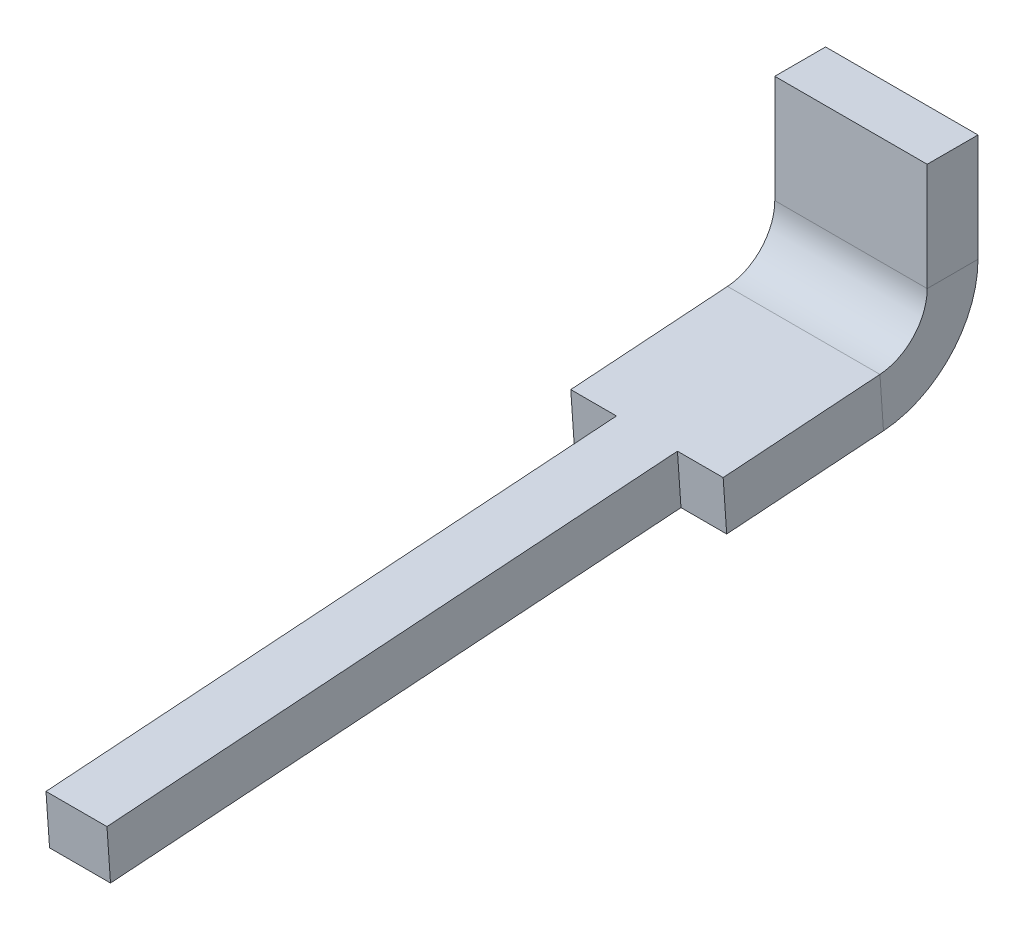
ISO-10303-21;
HEADER;
FILE_DESCRIPTION(('STEP AP214'),'2;1');
FILE_NAME('part.step','',(''),(''),'','','');
FILE_SCHEMA(('AUTOMOTIVE_DESIGN { 1 0 10303 214 1 1 1 1 }'));
ENDSEC;
DATA;
#1=APPLICATION_CONTEXT('core data for automotive mechanical design processes');
#2=APPLICATION_PROTOCOL_DEFINITION('international standard','automotive_design',2000,#1);
#3=PRODUCT_CONTEXT('',#1,'mechanical');
#4=PRODUCT('Part','Part','',(#3));
#5=PRODUCT_RELATED_PRODUCT_CATEGORY('part','',(#4));
#6=PRODUCT_DEFINITION_FORMATION('','',#4);
#7=PRODUCT_DEFINITION_CONTEXT('part definition',#1,'design');
#8=PRODUCT_DEFINITION('design','',#6,#7);
#9=PRODUCT_DEFINITION_SHAPE('','',#8);
#10=(LENGTH_UNIT() NAMED_UNIT(*) SI_UNIT(.MILLI.,.METRE.));
#11=(NAMED_UNIT(*) PLANE_ANGLE_UNIT() SI_UNIT($,.RADIAN.));
#12=(NAMED_UNIT(*) SI_UNIT($,.STERADIAN.) SOLID_ANGLE_UNIT());
#13=UNCERTAINTY_MEASURE_WITH_UNIT(LENGTH_MEASURE(1.E-05),#10,'distance_accuracy_value','');
#14=(GEOMETRIC_REPRESENTATION_CONTEXT(3) GLOBAL_UNCERTAINTY_ASSIGNED_CONTEXT((#13)) GLOBAL_UNIT_ASSIGNED_CONTEXT((#10,
#11,#12)) REPRESENTATION_CONTEXT('',''));
#15=CARTESIAN_POINT('',(0.,0.,0.));
#16=DIRECTION('',(0.,0.,1.));
#17=DIRECTION('',(1.,0.,0.));
#18=AXIS2_PLACEMENT_3D('',#15,#16,#17);
#19=CARTESIAN_POINT('',(3.88578058618805E-13,-2.2413203435652,-0.01));
#20=DIRECTION('',(0.,-1.,0.));
#21=DIRECTION('',(1.,0.,0.));
#22=AXIS2_PLACEMENT_3D('',#19,#20,#21);
#23=PLANE('',#22);
#24=DIRECTION('',(1.,0.,0.));
#25=VECTOR('',#24,1.);
#26=CARTESIAN_POINT('',(0.,-2.2413203435652,0.5));
#27=LINE('',#26,#25);
#28=CARTESIAN_POINT('',(13.077499999997,-2.2413203435652,0.5));
#29=VERTEX_POINT('',#28);
#30=CARTESIAN_POINT('',(14.5775000000007,-2.2413203435652,0.5));
#31=VERTEX_POINT('',#30);
#32=EDGE_CURVE('E11',#29,#31,#27,.T.);
#33=ORIENTED_EDGE('',*,*,#32,.T.);
#34=DIRECTION('',(0.,0.,1.));
#35=VECTOR('',#34,1.);
#36=CARTESIAN_POINT('',(14.5775000000007,-2.2413203435652,0.5));
#37=LINE('',#36,#35);
#38=CARTESIAN_POINT('',(14.5775000000007,-2.2413203435652,0.));
#39=VERTEX_POINT('',#38);
#40=EDGE_CURVE('E24',#39,#31,#37,.T.);
#41=ORIENTED_EDGE('',*,*,#40,.F.);
#42=DIRECTION('',(1.,0.,0.));
#43=VECTOR('',#42,1.);
#44=CARTESIAN_POINT('',(0.,-2.2413203435652,0.));
#45=LINE('',#44,#43);
#46=CARTESIAN_POINT('',(13.077499999997,-2.2413203435652,0.));
#47=VERTEX_POINT('',#46);
#48=EDGE_CURVE('E211',#47,#39,#45,.T.);
#49=ORIENTED_EDGE('',*,*,#48,.F.);
#50=DIRECTION('',(0.,0.,-1.));
#51=VECTOR('',#50,1.);
#52=CARTESIAN_POINT('',(13.077499999997,-2.2413203435652,0.5));
#53=LINE('',#52,#51);
#54=EDGE_CURVE('E208',#29,#47,#53,.T.);
#55=ORIENTED_EDGE('',*,*,#54,.F.);
#56=EDGE_LOOP('',(#33,#41,#49,#55));
#57=FACE_BOUND('',#56,.T.);
#58=ADVANCED_FACE('F17',(#57),#23,.F.);
#59=CARTESIAN_POINT('',(13.077499999997,0.,0.5));
#60=DIRECTION('',(1.,0.,0.));
#61=DIRECTION('',(0.,0.,-1.));
#62=AXIS2_PLACEMENT_3D('',#59,#60,#61);
#63=PLANE('',#62);
#64=DIRECTION('',(0.,-1.,0.));
#65=VECTOR('',#64,1.);
#66=CARTESIAN_POINT('',(13.077499999997,0.,0.5));
#67=LINE('',#66,#65);
#68=CARTESIAN_POINT('',(13.077499999997,-3.3009203435652,0.5));
#69=VERTEX_POINT('',#68);
#70=EDGE_CURVE('E206',#29,#69,#67,.T.);
#71=ORIENTED_EDGE('',*,*,#70,.F.);
#72=ORIENTED_EDGE('',*,*,#54,.T.);
#73=DIRECTION('',(0.,-1.,0.));
#74=VECTOR('',#73,1.);
#75=CARTESIAN_POINT('',(13.077499999997,0.,0.));
#76=LINE('',#75,#74);
#77=CARTESIAN_POINT('',(13.077499999997,-3.3009203435652,0.));
#78=VERTEX_POINT('',#77);
#79=EDGE_CURVE('E204',#47,#78,#76,.T.);
#80=ORIENTED_EDGE('',*,*,#79,.T.);
#81=DIRECTION('',(0.,0.,1.));
#82=VECTOR('',#81,1.);
#83=CARTESIAN_POINT('',(13.077499999997,-3.3009203435652,0.499999999999977));
#84=LINE('',#83,#82);
#85=EDGE_CURVE('E201',#78,#69,#84,.T.);
#86=ORIENTED_EDGE('',*,*,#85,.T.);
#87=EDGE_LOOP('',(#71,#72,#80,#86));
#88=FACE_BOUND('',#87,.T.);
#89=ADVANCED_FACE('F265',(#88),#63,.F.);
#90=CARTESIAN_POINT('',(0.,0.,0.5));
#91=DIRECTION('',(0.,0.,1.));
#92=DIRECTION('',(1.,0.,0.));
#93=AXIS2_PLACEMENT_3D('',#90,#91,#92);
#94=PLANE('',#93);
#95=ORIENTED_EDGE('',*,*,#32,.F.);
#96=ORIENTED_EDGE('',*,*,#70,.T.);
#97=DIRECTION('',(-1.,0.,0.));
#98=VECTOR('',#97,1.);
#99=CARTESIAN_POINT('',(0.,-3.3009203435652,0.5));
#100=LINE('',#99,#98);
#101=CARTESIAN_POINT('',(14.5775000000007,-3.3009203435652,0.5));
#102=VERTEX_POINT('',#101);
#103=EDGE_CURVE('E198',#102,#69,#100,.T.);
#104=ORIENTED_EDGE('',*,*,#103,.F.);
#105=DIRECTION('',(0.,1.,0.));
#106=VECTOR('',#105,1.);
#107=CARTESIAN_POINT('',(14.5775000000007,0.,0.5));
#108=LINE('',#107,#106);
#109=EDGE_CURVE('E196',#102,#31,#108,.T.);
#110=ORIENTED_EDGE('',*,*,#109,.T.);
#111=EDGE_LOOP('',(#95,#96,#104,#110));
#112=FACE_BOUND('',#111,.T.);
#113=ADVANCED_FACE('F217',(#112),#94,.T.);
#114=CARTESIAN_POINT('',(0.,0.,0.));
#115=DIRECTION('',(0.,0.,1.));
#116=DIRECTION('',(1.,0.,0.));
#117=AXIS2_PLACEMENT_3D('',#114,#115,#116);
#118=PLANE('',#117);
#119=ORIENTED_EDGE('',*,*,#79,.F.);
#120=ORIENTED_EDGE('',*,*,#48,.T.);
#121=DIRECTION('',(0.,1.,0.));
#122=VECTOR('',#121,1.);
#123=CARTESIAN_POINT('',(14.5775000000007,0.,0.));
#124=LINE('',#123,#122);
#125=CARTESIAN_POINT('',(14.5775000000007,-3.3009203435652,0.));
#126=VERTEX_POINT('',#125);
#127=EDGE_CURVE('E193',#126,#39,#124,.T.);
#128=ORIENTED_EDGE('',*,*,#127,.F.);
#129=DIRECTION('',(-1.,0.,0.));
#130=VECTOR('',#129,1.);
#131=CARTESIAN_POINT('',(0.,-3.3009203435652,0.));
#132=LINE('',#131,#130);
#133=EDGE_CURVE('E190',#126,#78,#132,.T.);
#134=ORIENTED_EDGE('',*,*,#133,.T.);
#135=EDGE_LOOP('',(#119,#120,#128,#134));
#136=FACE_BOUND('',#135,.T.);
#137=ADVANCED_FACE('F273',(#136),#118,.F.);
#138=CARTESIAN_POINT('',(13.077499999997,-3.3009203435652,1.));
#139=DIRECTION('',(1.,0.,0.));
#140=DIRECTION('',(0.,0.,-1.));
#141=AXIS2_PLACEMENT_3D('',#138,#139,#140);
#142=PLANE('',#141);
#143=CARTESIAN_POINT('',(13.077499999997,-3.3009203435652,1.));
#144=DIRECTION('',(-1.,0.,0.));
#145=DIRECTION('',(0.,0.,-1.));
#146=AXIS2_PLACEMENT_3D('',#143,#144,#145);
#147=CIRCLE('',#146,1.);
#148=CARTESIAN_POINT('',(13.077499999997,-4.298484393825,0.930243526255876));
#149=VERTEX_POINT('',#148);
#150=EDGE_CURVE('E188',#78,#149,#147,.T.);
#151=ORIENTED_EDGE('',*,*,#150,.T.);
#152=DIRECTION('',(0.,0.997564050259824,0.0697564737441289));
#153=VECTOR('',#152,1.);
#154=CARTESIAN_POINT('',(13.077499999997,-3.7997023686951,0.965121763127938));
#155=LINE('',#154,#153);
#156=CARTESIAN_POINT('',(13.077499999997,-3.7997023686951,0.965121763127939));
#157=VERTEX_POINT('',#156);
#158=EDGE_CURVE('E186',#149,#157,#155,.T.);
#159=ORIENTED_EDGE('',*,*,#158,.T.);
#160=CARTESIAN_POINT('',(13.077499999997,-3.3009203435652,1.));
#161=DIRECTION('',(-1.,0.,0.));
#162=DIRECTION('',(0.,0.,1.));
#163=AXIS2_PLACEMENT_3D('',#160,#161,#162);
#164=CIRCLE('',#163,0.5);
#165=EDGE_CURVE('E183',#69,#157,#164,.T.);
#166=ORIENTED_EDGE('',*,*,#165,.F.);
#167=ORIENTED_EDGE('',*,*,#85,.F.);
#168=EDGE_LOOP('',(#151,#159,#166,#167));
#169=FACE_BOUND('',#168,.T.);
#170=ADVANCED_FACE('F226',(#169),#142,.F.);
#171=CARTESIAN_POINT('',(14.5775000000007,0.,0.5));
#172=DIRECTION('',(-1.,0.,0.));
#173=DIRECTION('',(0.,-1.,0.));
#174=AXIS2_PLACEMENT_3D('',#171,#172,#173);
#175=PLANE('',#174);
#176=ORIENTED_EDGE('',*,*,#127,.T.);
#177=ORIENTED_EDGE('',*,*,#40,.T.);
#178=ORIENTED_EDGE('',*,*,#109,.F.);
#179=DIRECTION('',(0.,0.,-1.));
#180=VECTOR('',#179,1.);
#181=CARTESIAN_POINT('',(14.5775000000007,-3.3009203435652,0.499999999999977));
#182=LINE('',#181,#180);
#183=EDGE_CURVE('E180',#102,#126,#182,.T.);
#184=ORIENTED_EDGE('',*,*,#183,.T.);
#185=EDGE_LOOP('',(#176,#177,#178,#184));
#186=FACE_BOUND('',#185,.T.);
#187=ADVANCED_FACE('F215',(#186),#175,.F.);
#188=CARTESIAN_POINT('',(11.8865505878094,-3.3009203435652,1.));
#189=DIRECTION('',(1.,0.,0.));
#190=DIRECTION('',(0.,0.,-1.));
#191=AXIS2_PLACEMENT_3D('',#188,#189,#190);
#192=CYLINDRICAL_SURFACE('',#191,1.);
#193=ORIENTED_EDGE('',*,*,#133,.F.);
#194=CARTESIAN_POINT('',(14.5775000000007,-3.3009203435652,1.));
#195=DIRECTION('',(1.,0.,0.));
#196=DIRECTION('',(0.,0.,-1.));
#197=AXIS2_PLACEMENT_3D('',#194,#195,#196);
#198=CIRCLE('',#197,1.);
#199=CARTESIAN_POINT('',(14.5775000000007,-4.298484393825,0.930243526255876));
#200=VERTEX_POINT('',#199);
#201=EDGE_CURVE('E177',#200,#126,#198,.T.);
#202=ORIENTED_EDGE('',*,*,#201,.F.);
#203=DIRECTION('',(-1.,0.,0.));
#204=VECTOR('',#203,1.);
#205=CARTESIAN_POINT('',(0.,-4.298484393825,0.930243526255876));
#206=LINE('',#205,#204);
#207=EDGE_CURVE('E174',#200,#149,#206,.T.);
#208=ORIENTED_EDGE('',*,*,#207,.T.);
#209=ORIENTED_EDGE('',*,*,#150,.F.);
#210=EDGE_LOOP('',(#193,#202,#208,#209));
#211=FACE_BOUND('',#210,.T.);
#212=ADVANCED_FACE('F236',(#211),#192,.T.);
#213=CARTESIAN_POINT('',(14.5775000000007,-3.3009203435652,1.));
#214=DIRECTION('',(-1.,0.,0.));
#215=DIRECTION('',(0.,0.,1.));
#216=AXIS2_PLACEMENT_3D('',#213,#214,#215);
#217=PLANE('',#216);
#218=DIRECTION('',(0.,-0.997564050259824,-0.0697564737441289));
#219=VECTOR('',#218,1.);
#220=CARTESIAN_POINT('',(14.5775000000007,-3.7997023686951,0.965121763127938));
#221=LINE('',#220,#219);
#222=CARTESIAN_POINT('',(14.5775000000007,-3.7997023686951,0.965121763127938));
#223=VERTEX_POINT('',#222);
#224=EDGE_CURVE('E171',#223,#200,#221,.T.);
#225=ORIENTED_EDGE('',*,*,#224,.T.);
#226=ORIENTED_EDGE('',*,*,#201,.T.);
#227=ORIENTED_EDGE('',*,*,#183,.F.);
#228=CARTESIAN_POINT('',(14.5775000000007,-3.3009203435652,1.));
#229=DIRECTION('',(1.,0.,0.));
#230=DIRECTION('',(0.,0.,-1.));
#231=AXIS2_PLACEMENT_3D('',#228,#229,#230);
#232=CIRCLE('',#231,0.5);
#233=EDGE_CURVE('E168',#223,#102,#232,.T.);
#234=ORIENTED_EDGE('',*,*,#233,.F.);
#235=EDGE_LOOP('',(#225,#226,#227,#234));
#236=FACE_BOUND('',#235,.T.);
#237=ADVANCED_FACE('F254',(#236),#217,.F.);
#238=CARTESIAN_POINT('',(11.8865505878094,-3.3009203435652,1.));
#239=DIRECTION('',(1.,0.,0.));
#240=DIRECTION('',(0.,0.,-1.));
#241=AXIS2_PLACEMENT_3D('',#238,#239,#240);
#242=CYLINDRICAL_SURFACE('',#241,0.5);
#243=ORIENTED_EDGE('',*,*,#103,.T.);
#244=ORIENTED_EDGE('',*,*,#165,.T.);
#245=DIRECTION('',(-1.,0.,0.));
#246=VECTOR('',#245,1.);
#247=CARTESIAN_POINT('',(0.,-3.7997023686951,0.965121763127941));
#248=LINE('',#247,#246);
#249=EDGE_CURVE('E165',#223,#157,#248,.T.);
#250=ORIENTED_EDGE('',*,*,#249,.F.);
#251=ORIENTED_EDGE('',*,*,#233,.T.);
#252=EDGE_LOOP('',(#243,#244,#250,#251));
#253=FACE_BOUND('',#252,.T.);
#254=ADVANCED_FACE('F221',(#253),#242,.F.);
#255=CARTESIAN_POINT('',(13.077499999997,-3.4909143362964,-3.4507528322724));
#256=DIRECTION('',(1.,0.,0.));
#257=DIRECTION('',(0.,-0.997564050259825,-0.0697564737441219));
#258=AXIS2_PLACEMENT_3D('',#255,#256,#257);
#259=PLANE('',#258);
#260=ORIENTED_EDGE('',*,*,#158,.F.);
#261=DIRECTION('',(0.,-0.0697564737441219,0.997564050259824));
#262=VECTOR('',#261,1.);
#263=CARTESIAN_POINT('',(13.077499999997,-3.9896963614263,-3.4856310691444));
#264=LINE('',#263,#262);
#265=CARTESIAN_POINT('',(13.077499999997,-4.4063741251374,2.4731385662806));
#266=VERTEX_POINT('',#265);
#267=EDGE_CURVE('E163',#149,#266,#264,.T.);
#268=ORIENTED_EDGE('',*,*,#267,.T.);
#269=DIRECTION('',(0.,-0.997564050259824,-0.0697564737441219));
#270=VECTOR('',#269,1.);
#271=CARTESIAN_POINT('',(13.077499999997,-3.9075921000075,2.5080168031527));
#272=LINE('',#271,#270);
#273=CARTESIAN_POINT('',(13.077499999997,-3.9075921000075,2.5080168031527));
#274=VERTEX_POINT('',#273);
#275=EDGE_CURVE('E160',#274,#266,#272,.T.);
#276=ORIENTED_EDGE('',*,*,#275,.F.);
#277=DIRECTION('',(0.,-0.0697564737441219,0.997564050259824));
#278=VECTOR('',#277,1.);
#279=CARTESIAN_POINT('',(13.077499999997,-3.4909143362964,-3.4507528322724));
#280=LINE('',#279,#278);
#281=EDGE_CURVE('E157',#157,#274,#280,.T.);
#282=ORIENTED_EDGE('',*,*,#281,.F.);
#283=EDGE_LOOP('',(#260,#268,#276,#282));
#284=FACE_BOUND('',#283,.T.);
#285=ADVANCED_FACE('F231',(#284),#259,.F.);
#286=CARTESIAN_POINT('',(0.,-3.9896963614263,-3.4856310691444));
#287=DIRECTION('',(0.,0.997564050259825,0.0697564737441219));
#288=DIRECTION('',(1.,0.,0.));
#289=AXIS2_PLACEMENT_3D('',#286,#287,#288);
#290=PLANE('',#289);
#291=ORIENTED_EDGE('',*,*,#207,.F.);
#292=DIRECTION('',(0.,0.0697564737441219,-0.997564050259824));
#293=VECTOR('',#292,1.);
#294=CARTESIAN_POINT('',(14.5775000000007,-3.9896963614263,-3.4856310691445));
#295=LINE('',#294,#293);
#296=CARTESIAN_POINT('',(14.5775000000007,-4.4063741251374,2.4731385662806));
#297=VERTEX_POINT('',#296);
#298=EDGE_CURVE('E154',#297,#200,#295,.T.);
#299=ORIENTED_EDGE('',*,*,#298,.F.);
#300=DIRECTION('',(1.,0.,0.));
#301=VECTOR('',#300,1.);
#302=CARTESIAN_POINT('',(0.,-4.4063741251374,2.4731385662806));
#303=LINE('',#302,#301);
#304=CARTESIAN_POINT('',(14.1274999999978,-4.4063741251374,2.4731385662806));
#305=VERTEX_POINT('',#304);
#306=EDGE_CURVE('E152',#305,#297,#303,.T.);
#307=ORIENTED_EDGE('',*,*,#306,.F.);
#308=DIRECTION('',(0.,0.0697564737441219,-0.997564050259824));
#309=VECTOR('',#308,1.);
#310=CARTESIAN_POINT('',(14.1274999999978,-3.9896963614263,-3.4856310691444));
#311=LINE('',#310,#309);
#312=CARTESIAN_POINT('',(14.1274999999978,-4.7989635593689,8.0874290411376));
#313=VERTEX_POINT('',#312);
#314=EDGE_CURVE('E125',#313,#305,#311,.T.);
#315=ORIENTED_EDGE('',*,*,#314,.F.);
#316=DIRECTION('',(1.,0.,0.));
#317=VECTOR('',#316,1.);
#318=CARTESIAN_POINT('',(0.,-4.7989635593689,8.0874290411376));
#319=LINE('',#318,#317);
#320=CARTESIAN_POINT('',(13.5274999999998,-4.7989635593689,8.0874290411376));
#321=VERTEX_POINT('',#320);
#322=EDGE_CURVE('E148',#321,#313,#319,.T.);
#323=ORIENTED_EDGE('',*,*,#322,.F.);
#324=DIRECTION('',(0.,-0.0697564737441219,0.997564050259824));
#325=VECTOR('',#324,1.);
#326=CARTESIAN_POINT('',(13.5274999999998,-3.9896963614263,-3.4856310691444));
#327=LINE('',#326,#325);
#328=CARTESIAN_POINT('',(13.5274999999998,-4.4063741251374,2.4731385662806));
#329=VERTEX_POINT('',#328);
#330=EDGE_CURVE('E145',#329,#321,#327,.T.);
#331=ORIENTED_EDGE('',*,*,#330,.F.);
#332=DIRECTION('',(1.,0.,0.));
#333=VECTOR('',#332,1.);
#334=CARTESIAN_POINT('',(0.,-4.4063741251374,2.4731385662806));
#335=LINE('',#334,#333);
#336=EDGE_CURVE('E142',#266,#329,#335,.T.);
#337=ORIENTED_EDGE('',*,*,#336,.F.);
#338=ORIENTED_EDGE('',*,*,#267,.F.);
#339=EDGE_LOOP('',(#291,#299,#307,#315,#323,#331,#337,#338));
#340=FACE_BOUND('',#339,.T.);
#341=ADVANCED_FACE('F239',(#340),#290,.F.);
#342=CARTESIAN_POINT('',(14.5775000000007,-3.4909143362964,-3.4507528322724));
#343=DIRECTION('',(-1.,0.,0.));
#344=DIRECTION('',(0.,-0.0697564737441219,0.997564050259825));
#345=AXIS2_PLACEMENT_3D('',#342,#343,#344);
#346=PLANE('',#345);
#347=ORIENTED_EDGE('',*,*,#224,.F.);
#348=DIRECTION('',(0.,0.0697564737441219,-0.997564050259824));
#349=VECTOR('',#348,1.);
#350=CARTESIAN_POINT('',(14.5775000000007,-3.4909143362964,-3.4507528322724));
#351=LINE('',#350,#349);
#352=CARTESIAN_POINT('',(14.5775000000007,-3.9075921000075,2.5080168031527));
#353=VERTEX_POINT('',#352);
#354=EDGE_CURVE('E140',#353,#223,#351,.T.);
#355=ORIENTED_EDGE('',*,*,#354,.F.);
#356=DIRECTION('',(0.,-0.997564050259824,-0.0697564737441219));
#357=VECTOR('',#356,1.);
#358=CARTESIAN_POINT('',(14.5775000000007,-3.9075921000075,2.5080168031527));
#359=LINE('',#358,#357);
#360=EDGE_CURVE('E120',#353,#297,#359,.T.);
#361=ORIENTED_EDGE('',*,*,#360,.T.);
#362=ORIENTED_EDGE('',*,*,#298,.T.);
#363=EDGE_LOOP('',(#347,#355,#361,#362));
#364=FACE_BOUND('',#363,.T.);
#365=ADVANCED_FACE('F252',(#364),#346,.F.);
#366=CARTESIAN_POINT('',(0.,-3.4909143362964,-3.4507528322724));
#367=DIRECTION('',(0.,0.997564050259825,0.0697564737441219));
#368=DIRECTION('',(1.,0.,0.));
#369=AXIS2_PLACEMENT_3D('',#366,#367,#368);
#370=PLANE('',#369);
#371=ORIENTED_EDGE('',*,*,#354,.T.);
#372=ORIENTED_EDGE('',*,*,#249,.T.);
#373=ORIENTED_EDGE('',*,*,#281,.T.);
#374=DIRECTION('',(1.,0.,0.));
#375=VECTOR('',#374,1.);
#376=CARTESIAN_POINT('',(0.,-3.9075921000075,2.5080168031527));
#377=LINE('',#376,#375);
#378=CARTESIAN_POINT('',(13.5274999999998,-3.9075921000075,2.5080168031527));
#379=VERTEX_POINT('',#378);
#380=EDGE_CURVE('E137',#274,#379,#377,.T.);
#381=ORIENTED_EDGE('',*,*,#380,.T.);
#382=DIRECTION('',(0.,-0.0697564737441219,0.997564050259824));
#383=VECTOR('',#382,1.);
#384=CARTESIAN_POINT('',(13.5274999999998,-3.4909143362964,-3.4507528322724));
#385=LINE('',#384,#383);
#386=CARTESIAN_POINT('',(13.5274999999998,-4.300181534239,8.1223072780096));
#387=VERTEX_POINT('',#386);
#388=EDGE_CURVE('E135',#379,#387,#385,.T.);
#389=ORIENTED_EDGE('',*,*,#388,.T.);
#390=DIRECTION('',(1.,0.,0.));
#391=VECTOR('',#390,1.);
#392=CARTESIAN_POINT('',(0.,-4.300181534239,8.1223072780096));
#393=LINE('',#392,#391);
#394=CARTESIAN_POINT('',(14.1274999999978,-4.300181534239,8.1223072780096));
#395=VERTEX_POINT('',#394);
#396=EDGE_CURVE('E107',#387,#395,#393,.T.);
#397=ORIENTED_EDGE('',*,*,#396,.T.);
#398=DIRECTION('',(0.,0.0697564737441219,-0.997564050259824));
#399=VECTOR('',#398,1.);
#400=CARTESIAN_POINT('',(14.1274999999978,-3.4909143362964,-3.4507528322724));
#401=LINE('',#400,#399);
#402=CARTESIAN_POINT('',(14.1274999999978,-3.9075921000075,2.5080168031527));
#403=VERTEX_POINT('',#402);
#404=EDGE_CURVE('E101',#395,#403,#401,.T.);
#405=ORIENTED_EDGE('',*,*,#404,.T.);
#406=DIRECTION('',(1.,0.,0.));
#407=VECTOR('',#406,1.);
#408=CARTESIAN_POINT('',(0.,-3.9075921000075,2.5080168031527));
#409=LINE('',#408,#407);
#410=EDGE_CURVE('E105',#403,#353,#409,.T.);
#411=ORIENTED_EDGE('',*,*,#410,.T.);
#412=EDGE_LOOP('',(#371,#372,#373,#381,#389,#397,#405,#411));
#413=FACE_BOUND('',#412,.T.);
#414=ADVANCED_FACE('F104',(#413),#370,.T.);
#415=CARTESIAN_POINT('',(0.,-3.9075921000075,2.5080168031527));
#416=DIRECTION('',(0.,0.0697564737441219,-0.997564050259825));
#417=DIRECTION('',(0.,0.997564050259825,0.0697564737441219));
#418=AXIS2_PLACEMENT_3D('',#415,#416,#417);
#419=PLANE('',#418);
#420=ORIENTED_EDGE('',*,*,#336,.T.);
#421=DIRECTION('',(0.,-0.997564050259824,-0.0697564737441219));
#422=VECTOR('',#421,1.);
#423=CARTESIAN_POINT('',(13.5274999999998,-3.9075921000075,2.5080168031527));
#424=LINE('',#423,#422);
#425=EDGE_CURVE('E121',#379,#329,#424,.T.);
#426=ORIENTED_EDGE('',*,*,#425,.F.);
#427=ORIENTED_EDGE('',*,*,#380,.F.);
#428=ORIENTED_EDGE('',*,*,#275,.T.);
#429=EDGE_LOOP('',(#420,#426,#427,#428));
#430=FACE_BOUND('',#429,.T.);
#431=ADVANCED_FACE('F242',(#430),#419,.F.);
#432=CARTESIAN_POINT('',(0.,-3.9075921000075,2.5080168031527));
#433=DIRECTION('',(0.,0.0697564737441219,-0.997564050259825));
#434=DIRECTION('',(0.,0.997564050259825,0.0697564737441219));
#435=AXIS2_PLACEMENT_3D('',#432,#433,#434);
#436=PLANE('',#435);
#437=ORIENTED_EDGE('',*,*,#306,.T.);
#438=ORIENTED_EDGE('',*,*,#360,.F.);
#439=ORIENTED_EDGE('',*,*,#410,.F.);
#440=DIRECTION('',(0.,-0.997564050259824,-0.0697564737441219));
#441=VECTOR('',#440,1.);
#442=CARTESIAN_POINT('',(14.1274999999978,-3.9075921000075,2.5080168031527));
#443=LINE('',#442,#441);
#444=EDGE_CURVE('E118',#403,#305,#443,.T.);
#445=ORIENTED_EDGE('',*,*,#444,.T.);
#446=EDGE_LOOP('',(#437,#438,#439,#445));
#447=FACE_BOUND('',#446,.T.);
#448=ADVANCED_FACE('F117',(#447),#436,.F.);
#449=CARTESIAN_POINT('',(14.1274999999978,-3.4909143362964,-3.4507528322724));
#450=DIRECTION('',(-1.,0.,0.));
#451=DIRECTION('',(0.,0.997564050259825,0.0697564737441219));
#452=AXIS2_PLACEMENT_3D('',#449,#450,#451);
#453=PLANE('',#452);
#454=ORIENTED_EDGE('',*,*,#314,.T.);
#455=ORIENTED_EDGE('',*,*,#444,.F.);
#456=ORIENTED_EDGE('',*,*,#404,.F.);
#457=DIRECTION('',(0.,-0.997564050259824,-0.0697564737441219));
#458=VECTOR('',#457,1.);
#459=CARTESIAN_POINT('',(14.1274999999978,-4.300181534239,8.1223072780096));
#460=LINE('',#459,#458);
#461=EDGE_CURVE('E126',#395,#313,#460,.T.);
#462=ORIENTED_EDGE('',*,*,#461,.T.);
#463=EDGE_LOOP('',(#454,#455,#456,#462));
#464=FACE_BOUND('',#463,.T.);
#465=ADVANCED_FACE('F124',(#464),#453,.F.);
#466=CARTESIAN_POINT('',(0.,-4.300181534239,8.1223072780096));
#467=DIRECTION('',(0.,0.0697564737441219,-0.997564050259825));
#468=DIRECTION('',(0.,0.997564050259825,0.0697564737441219));
#469=AXIS2_PLACEMENT_3D('',#466,#467,#468);
#470=PLANE('',#469);
#471=ORIENTED_EDGE('',*,*,#322,.T.);
#472=ORIENTED_EDGE('',*,*,#461,.F.);
#473=ORIENTED_EDGE('',*,*,#396,.F.);
#474=DIRECTION('',(0.,-0.997564050259824,-0.0697564737441219));
#475=VECTOR('',#474,1.);
#476=CARTESIAN_POINT('',(13.5274999999998,-4.300181534239,8.1223072780096));
#477=LINE('',#476,#475);
#478=EDGE_CURVE('E130',#387,#321,#477,.T.);
#479=ORIENTED_EDGE('',*,*,#478,.T.);
#480=EDGE_LOOP('',(#471,#472,#473,#479));
#481=FACE_BOUND('',#480,.T.);
#482=ADVANCED_FACE('F250',(#481),#470,.F.);
#483=CARTESIAN_POINT('',(13.5274999999998,-3.4909143362964,-3.4507528322724));
#484=DIRECTION('',(1.,0.,0.));
#485=DIRECTION('',(0.,-0.997564050259825,-0.0697564737441219));
#486=AXIS2_PLACEMENT_3D('',#483,#484,#485);
#487=PLANE('',#486);
#488=ORIENTED_EDGE('',*,*,#330,.T.);
#489=ORIENTED_EDGE('',*,*,#478,.F.);
#490=ORIENTED_EDGE('',*,*,#388,.F.);
#491=ORIENTED_EDGE('',*,*,#425,.T.);
#492=EDGE_LOOP('',(#488,#489,#490,#491));
#493=FACE_BOUND('',#492,.T.);
#494=ADVANCED_FACE('F246',(#493),#487,.F.);
#495=CLOSED_SHELL('',(#58,#89,#113,#137,#170,#187,#212,#237,#254,#285,#341,#365,#414,#431,#448,
#465,#482,#494));
#496=MANIFOLD_SOLID_BREP('B1',#495);
#497=ADVANCED_BREP_SHAPE_REPRESENTATION('',(#18,#496),#14);
#498=SHAPE_DEFINITION_REPRESENTATION(#9,#497);
ENDSEC;
END-ISO-10303-21;
